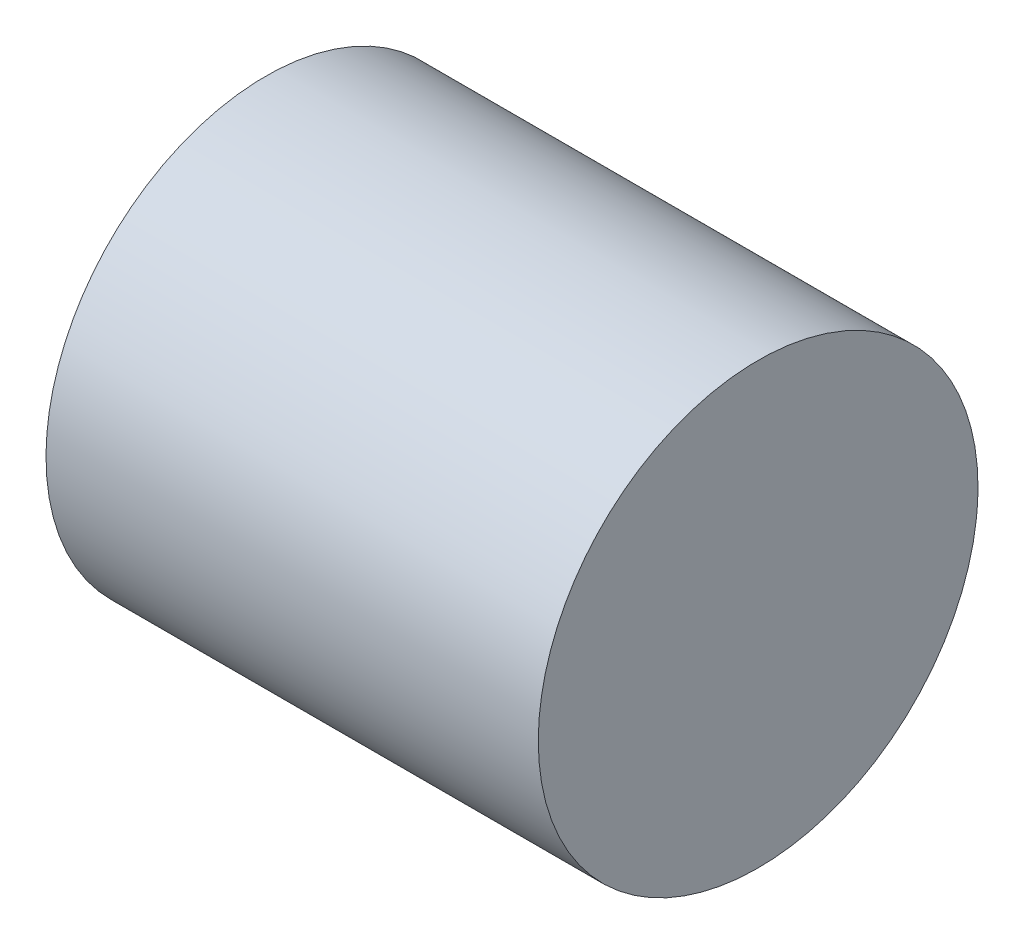
ISO-10303-21;
HEADER;
FILE_DESCRIPTION(('STEP AP214'),'2;1');
FILE_NAME('part.step','',(''),(''),'','','');
FILE_SCHEMA(('AUTOMOTIVE_DESIGN { 1 0 10303 214 1 1 1 1 }'));
ENDSEC;
DATA;
#1=APPLICATION_CONTEXT('core data for automotive mechanical design processes');
#2=APPLICATION_PROTOCOL_DEFINITION('international standard','automotive_design',2000,#1);
#3=PRODUCT_CONTEXT('',#1,'mechanical');
#4=PRODUCT('Part','Part','',(#3));
#5=PRODUCT_RELATED_PRODUCT_CATEGORY('part','',(#4));
#6=PRODUCT_DEFINITION_FORMATION('','',#4);
#7=PRODUCT_DEFINITION_CONTEXT('part definition',#1,'design');
#8=PRODUCT_DEFINITION('design','',#6,#7);
#9=PRODUCT_DEFINITION_SHAPE('','',#8);
#10=(LENGTH_UNIT() NAMED_UNIT(*) SI_UNIT(.MILLI.,.METRE.));
#11=(NAMED_UNIT(*) PLANE_ANGLE_UNIT() SI_UNIT($,.RADIAN.));
#12=(NAMED_UNIT(*) SI_UNIT($,.STERADIAN.) SOLID_ANGLE_UNIT());
#13=UNCERTAINTY_MEASURE_WITH_UNIT(LENGTH_MEASURE(1.E-05),#10,'distance_accuracy_value','');
#14=(GEOMETRIC_REPRESENTATION_CONTEXT(3) GLOBAL_UNCERTAINTY_ASSIGNED_CONTEXT((#13)) GLOBAL_UNIT_ASSIGNED_CONTEXT((#10,
#11,#12)) REPRESENTATION_CONTEXT('',''));
#15=CARTESIAN_POINT('',(0.,0.,0.));
#16=DIRECTION('',(0.,0.,1.));
#17=DIRECTION('',(1.,0.,0.));
#18=AXIS2_PLACEMENT_3D('',#15,#16,#17);
#19=CARTESIAN_POINT('',(-2.25,-0.125,0.25));
#20=CARTESIAN_POINT('',(-2.25,0.125,0.25));
#21=CARTESIAN_POINT('',(-2.25,-0.125,0.));
#22=CARTESIAN_POINT('',(-2.25,0.125,0.));
#23=(BOUNDED_SURFACE() B_SPLINE_SURFACE(1,1,((#19,#20),(#21,#22)),.UNSPECIFIED.,.F.,.F.,
.F.) B_SPLINE_SURFACE_WITH_KNOTS((2,2),(2,2),(-0.125,0.125),(-0.125,0.125),
.UNSPECIFIED.) GEOMETRIC_REPRESENTATION_ITEM() RATIONAL_B_SPLINE_SURFACE(((1.,1.),(1.,1.))) REPRESENTATION_ITEM('') SURFACE());
#24=CARTESIAN_POINT('',(-2.25,0.,0.));
#25=CARTESIAN_POINT('',(-2.25,0.216506350946,0.));
#26=CARTESIAN_POINT('',(-2.25,0.108253175473,0.1875));
#27=CARTESIAN_POINT('',(-2.25,0.,0.375));
#28=CARTESIAN_POINT('',(-2.25,-0.108253175473,0.1875));
#29=CARTESIAN_POINT('',(-2.25,-0.216506350946,0.));
#30=CARTESIAN_POINT('',(-2.25,0.,0.));
#31=(BOUNDED_CURVE() B_SPLINE_CURVE(2,(#24,#25,#26,#27,#28,#29,#30),.UNSPECIFIED.,.T.,
.F.) B_SPLINE_CURVE_WITH_KNOTS((3,2,2,3),(0.,2.094395102393,4.188790204786,6.28318530718),
.UNSPECIFIED.) CURVE() GEOMETRIC_REPRESENTATION_ITEM() RATIONAL_B_SPLINE_CURVE((1.,0.5,1.,0.5,
1.,0.5,1.)) REPRESENTATION_ITEM(''));
#32=CARTESIAN_POINT('',(-2.25,0.,0.));
#33=VERTEX_POINT('',#32);
#34=EDGE_CURVE('E23',#33,#33,#31,.T.);
#35=ORIENTED_EDGE('',*,*,#34,.F.);
#36=EDGE_LOOP('',(#35));
#37=FACE_BOUND('',#36,.T.);
#38=ADVANCED_FACE('F17',(#37),#23,.F.);
#39=CARTESIAN_POINT('',(-1.9701171875,-0.125,0.25));
#40=CARTESIAN_POINT('',(-1.9701171875,0.125,0.25));
#41=CARTESIAN_POINT('',(-1.9701171875,-0.125,0.));
#42=CARTESIAN_POINT('',(-1.9701171875,0.125,0.));
#43=(BOUNDED_SURFACE() B_SPLINE_SURFACE(1,1,((#39,#40),(#41,#42)),.UNSPECIFIED.,.F.,.F.,
.F.) B_SPLINE_SURFACE_WITH_KNOTS((2,2),(2,2),(-0.125,0.125),(-0.125,0.125),
.UNSPECIFIED.) GEOMETRIC_REPRESENTATION_ITEM() RATIONAL_B_SPLINE_SURFACE(((1.,1.),(1.,1.))) REPRESENTATION_ITEM('') SURFACE());
#44=CARTESIAN_POINT('',(-1.9701171875,0.,0.));
#45=CARTESIAN_POINT('',(-1.9701171875,0.216506350946,0.));
#46=CARTESIAN_POINT('',(-1.9701171875,0.108253175473,0.1875));
#47=CARTESIAN_POINT('',(-1.9701171875,0.,0.375));
#48=CARTESIAN_POINT('',(-1.9701171875,-0.108253175473,0.1875));
#49=CARTESIAN_POINT('',(-1.9701171875,-0.216506350946,0.));
#50=CARTESIAN_POINT('',(-1.9701171875,0.,0.));
#51=(BOUNDED_CURVE() B_SPLINE_CURVE(2,(#44,#45,#46,#47,#48,#49,#50),.UNSPECIFIED.,.T.,
.F.) B_SPLINE_CURVE_WITH_KNOTS((3,2,2,3),(0.,2.094395102393,4.188790204786,6.28318530718),
.UNSPECIFIED.) CURVE() GEOMETRIC_REPRESENTATION_ITEM() RATIONAL_B_SPLINE_CURVE((1.,0.5,1.,0.5,
1.,0.5,1.)) REPRESENTATION_ITEM(''));
#52=CARTESIAN_POINT('',(-1.9701171875,0.,0.));
#53=VERTEX_POINT('',#52);
#54=EDGE_CURVE('E11',#53,#53,#51,.T.);
#55=ORIENTED_EDGE('',*,*,#54,.T.);
#56=EDGE_LOOP('',(#55));
#57=FACE_BOUND('',#56,.T.);
#58=ADVANCED_FACE('F19',(#57),#43,.T.);
#59=CARTESIAN_POINT('',(-1.9701171875,0.,0.));
#60=CARTESIAN_POINT('',(-2.25,0.,0.));
#61=CARTESIAN_POINT('',(-1.9701171875,-0.216506350946,0.));
#62=CARTESIAN_POINT('',(-2.25,-0.216506350946,0.));
#63=CARTESIAN_POINT('',(-1.9701171875,-0.108253175473,0.1875));
#64=CARTESIAN_POINT('',(-2.25,-0.108253175473,0.1875));
#65=CARTESIAN_POINT('',(-1.9701171875,0.,0.375));
#66=CARTESIAN_POINT('',(-2.25,0.,0.375));
#67=CARTESIAN_POINT('',(-1.9701171875,0.108253175473,0.1875));
#68=CARTESIAN_POINT('',(-2.25,0.108253175473,0.1875));
#69=CARTESIAN_POINT('',(-1.9701171875,0.216506350946,0.));
#70=CARTESIAN_POINT('',(-2.25,0.216506350946,0.));
#71=CARTESIAN_POINT('',(-1.9701171875,0.,0.));
#72=CARTESIAN_POINT('',(-2.25,0.,0.));
#73=(BOUNDED_SURFACE() B_SPLINE_SURFACE(2,1,((#59,#60),(#61,#62),(#63,#64),(#65,#66),(#67,#68),
(#69,#70),(#71,#72)),.UNSPECIFIED.,.T.,.F.,.F.) B_SPLINE_SURFACE_WITH_KNOTS((3,2,2,3),(2,2),(0.,
2.094395102393,4.188790204786,6.28318530718),(0.,0.2798828125),
.UNSPECIFIED.) GEOMETRIC_REPRESENTATION_ITEM() RATIONAL_B_SPLINE_SURFACE(((1.,1.),(0.5,0.5),(1.,
1.),(0.5,0.5),(1.,1.),(0.5,0.5),(1.,1.))) REPRESENTATION_ITEM('') SURFACE());
#74=CARTESIAN_POINT('',(-1.9701171875,0.,0.));
#75=CARTESIAN_POINT('',(-2.25,0.,0.));
#76=(BOUNDED_CURVE() B_SPLINE_CURVE(1,(#74,#75),.UNSPECIFIED.,.F.,
.F.) B_SPLINE_CURVE_WITH_KNOTS((2,2),(0.,1.),
.UNSPECIFIED.) CURVE() GEOMETRIC_REPRESENTATION_ITEM() RATIONAL_B_SPLINE_CURVE((1.,1.)) REPRESENTATION_ITEM(''));
#77=EDGE_CURVE('E47',#53,#33,#76,.T.);
#78=ORIENTED_EDGE('',*,*,#77,.T.);
#79=ORIENTED_EDGE('',*,*,#34,.T.);
#80=ORIENTED_EDGE('',*,*,#77,.F.);
#81=ORIENTED_EDGE('',*,*,#54,.F.);
#82=EDGE_LOOP('',(#78,#79,#80,#81));
#83=FACE_BOUND('',#82,.T.);
#84=ADVANCED_FACE('F46',(#83),#73,.T.);
#85=CLOSED_SHELL('',(#38,#58,#84));
#86=MANIFOLD_SOLID_BREP('B1',#85);
#87=ADVANCED_BREP_SHAPE_REPRESENTATION('',(#18,#86),#14);
#88=SHAPE_DEFINITION_REPRESENTATION(#9,#87);
ENDSEC;
END-ISO-10303-21;
